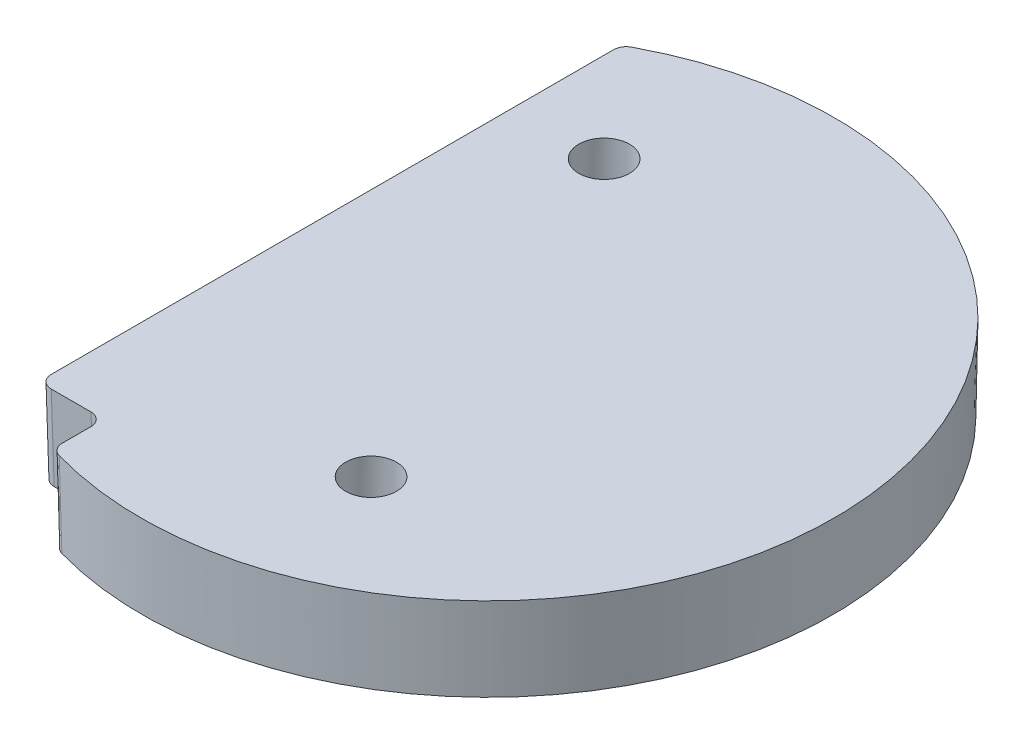
ISO-10303-21;
HEADER;
FILE_DESCRIPTION(('STEP AP214'),'2;1');
FILE_NAME('part.step','',(''),(''),'','','');
FILE_SCHEMA(('AUTOMOTIVE_DESIGN { 1 0 10303 214 1 1 1 1 }'));
ENDSEC;
DATA;
#1=APPLICATION_CONTEXT('core data for automotive mechanical design processes');
#2=APPLICATION_PROTOCOL_DEFINITION('international standard','automotive_design',2000,#1);
#3=PRODUCT_CONTEXT('',#1,'mechanical');
#4=PRODUCT('Part','Part','',(#3));
#5=PRODUCT_RELATED_PRODUCT_CATEGORY('part','',(#4));
#6=PRODUCT_DEFINITION_FORMATION('','',#4);
#7=PRODUCT_DEFINITION_CONTEXT('part definition',#1,'design');
#8=PRODUCT_DEFINITION('design','',#6,#7);
#9=PRODUCT_DEFINITION_SHAPE('','',#8);
#10=(LENGTH_UNIT() NAMED_UNIT(*) SI_UNIT(.MILLI.,.METRE.));
#11=(NAMED_UNIT(*) PLANE_ANGLE_UNIT() SI_UNIT($,.RADIAN.));
#12=(NAMED_UNIT(*) SI_UNIT($,.STERADIAN.) SOLID_ANGLE_UNIT());
#13=UNCERTAINTY_MEASURE_WITH_UNIT(LENGTH_MEASURE(1.E-05),#10,'distance_accuracy_value','');
#14=(GEOMETRIC_REPRESENTATION_CONTEXT(3) GLOBAL_UNCERTAINTY_ASSIGNED_CONTEXT((#13)) GLOBAL_UNIT_ASSIGNED_CONTEXT((#10,
#11,#12)) REPRESENTATION_CONTEXT('',''));
#15=CARTESIAN_POINT('',(0.,0.,0.));
#16=DIRECTION('',(0.,0.,1.));
#17=DIRECTION('',(1.,0.,0.));
#18=AXIS2_PLACEMENT_3D('',#15,#16,#17);
#19=CARTESIAN_POINT('',(0.,24.52774,12.));
#20=DIRECTION('',(0.,1.,0.));
#21=DIRECTION('',(1.,0.,0.));
#22=AXIS2_PLACEMENT_3D('',#19,#20,#21);
#23=CONICAL_SURFACE('',#22,8.2,0.0174532925199433);
#24=CARTESIAN_POINT('',(0.,22.52774,12.));
#25=DIRECTION('',(0.,-1.,0.));
#26=DIRECTION('',(1.,0.,0.));
#27=AXIS2_PLACEMENT_3D('',#24,#25,#26);
#28=CIRCLE('',#27,8.16508987014357);
#29=CARTESIAN_POINT('',(-3.80491359777918,22.52774,4.77564362029696));
#30=VERTEX_POINT('',#29);
#31=CARTESIAN_POINT('',(-2.20618229791224,22.52774,19.8613899697127));
#32=VERTEX_POINT('',#31);
#33=EDGE_CURVE('E107',#30,#32,#28,.T.);
#34=ORIENTED_EDGE('',*,*,#33,.F.);
#35=CARTESIAN_POINT('',(-3.71217040961339,8.03799381055322,5.19539749515387));
#36=CARTESIAN_POINT('',(-3.71213560727633,8.03599998599928,5.01027839007986));
#37=CARTESIAN_POINT('',(-3.54667220525729,8.03799381055322,4.92726666279457));
#38=CARTESIAN_POINT('',(-3.75723812207568,10.6199213283042,5.16758050246682));
#39=CARTESIAN_POINT('',(-3.75715307255751,10.6150488446717,4.9832482453097));
#40=CARTESIAN_POINT('',(-3.5927197204227,10.6199213283043,4.89994101683367));
#41=CARTESIAN_POINT('',(-3.80230586652925,13.2018506788342,5.13993382349185));
#42=CARTESIAN_POINT('',(-3.80222290444024,13.1970977839379,4.95634288757));
#43=CARTESIAN_POINT('',(-3.63874990637708,13.2018506788343,4.87278366437593));
#44=CARTESIAN_POINT('',(-3.89244141586427,18.365712841805,5.08496945897924));
#45=CARTESIAN_POINT('',(-3.89235899243341,18.3609908066135,4.90283774453859));
#46=CARTESIAN_POINT('',(-3.73077731451746,18.3657128418051,4.81879368934304));
#47=CARTESIAN_POINT('',(-3.93750922074572,20.9476456542458,5.05765177343662));
#48=CARTESIAN_POINT('',(-3.93742896675897,20.9430479064245,4.87623509737161));
#49=CARTESIAN_POINT('',(-3.77677453670396,20.9476456542458,4.79196106676297));
#50=CARTESIAN_POINT('',(-4.02764488870242,26.1115146130482,5.00333376098686));
#51=CARTESIAN_POINT('',(-4.02756525635232,26.106952478767,4.82332533585026));
#52=CARTESIAN_POINT('',(-3.86873771331154,26.1115146130482,4.73860869356104));
#53=CARTESIAN_POINT('',(-4.07271275177767,28.6934507594098,4.9763334340794));
#54=CARTESIAN_POINT('',(-4.07263506927037,28.6890003315474,4.79701556073125));
#55=CARTESIAN_POINT('',(-3.91470366773265,28.6934507594099,4.71208894293888));
#56=CARTESIAN_POINT('',(-4.16284853426273,33.8573262795375,4.92263948139414));
#57=CARTESIAN_POINT('',(-4.16277152442006,33.8529143886054,4.74468181268546));
#58=CARTESIAN_POINT('',(-4.00660583899555,33.8573262795376,4.65935149023351));
#59=CARTESIAN_POINT('',(-4.20791645367254,36.4392656533036,4.89594585562098));
#60=CARTESIAN_POINT('',(-4.20784146676971,36.4349696565178,4.71865535864417));
#61=CARTESIAN_POINT('',(-4.05254205583688,36.4392656533037,4.63313378815486));
#62=CARTESIAN_POINT('',(-4.25298439961586,39.0212065471737,4.86940025208404));
#63=CARTESIAN_POINT('',(-4.25295270639966,39.019390844034,4.69274260351006));
#64=CARTESIAN_POINT('',(-4.09846416826321,39.0212065471737,4.60706169905283));
#65=(BOUNDED_SURFACE() B_SPLINE_SURFACE(3,2,((#35,#36,#37),(#38,#39,#40),(#41,#42,#43),(#44,#45,
#46),(#47,#48,#49),(#50,#51,#52),(#53,#54,#55),(#56,#57,#58),(#59,#60,#61),(#62,#63,#64)),
.UNSPECIFIED.,.F.,.F.,.F.) B_SPLINE_SURFACE_WITH_KNOTS((4,2,2,2,4),(3,3),(0.,7.74741190296028,
15.4948236886408,23.2422354667816,30.9896473621978),(0.,1.),
.UNSPECIFIED.) GEOMETRIC_REPRESENTATION_ITEM() RATIONAL_B_SPLINE_SURFACE(((1.,0.851006268897824,
1.),(1.,0.851965571155234,1.),(1.,0.852906266586541,1.),(1.,0.854752433793589,1.),(1.,
0.855657905569863,1.),(1.,0.857435615491543,1.),(1.,0.858307853636982,1.),(1.,0.860020871956144,
1.),(1.,0.86086165212939,1.),(1.,0.861687591132487,1.))) REPRESENTATION_ITEM('') SURFACE());
#66=CARTESIAN_POINT('',(-3.54667220525729,8.03799381055322,4.92726666279457));
#67=CARTESIAN_POINT('',(-3.5927197204227,10.6199213283043,4.89994101683367));
#68=CARTESIAN_POINT('',(-3.63874990637708,13.2018506788343,4.87278366437593));
#69=CARTESIAN_POINT('',(-3.73077731451746,18.3657128418051,4.81879368934304));
#70=CARTESIAN_POINT('',(-3.77677453670396,20.9476456542458,4.79196106676297));
#71=CARTESIAN_POINT('',(-3.86873771331154,26.1115146130482,4.73860869356104));
#72=CARTESIAN_POINT('',(-3.91470366773265,28.6934507594099,4.71208894293888));
#73=CARTESIAN_POINT('',(-4.00660583899555,33.8573262795376,4.65935149023351));
#74=CARTESIAN_POINT('',(-4.05254205583688,36.4392656533037,4.63313378815486));
#75=CARTESIAN_POINT('',(-4.09846416826321,39.0212065471737,4.60706169905283));
#76=B_SPLINE_CURVE_WITH_KNOTS('',3,(#66,#67,#68,#69,#70,#71,#72,#73,#74,#75),.UNSPECIFIED.,.F.,
.F.,(4,2,2,2,4),(0.,7.74741190296028,15.4948236886408,23.2422354667816,30.9896473621978),.UNSPECIFIED.);
#77=CARTESIAN_POINT('',(-3.84053154309473,24.52774,4.75497981600505));
#78=VERTEX_POINT('',#77);
#79=EDGE_CURVE('E92',#30,#78,#76,.T.);
#80=ORIENTED_EDGE('',*,*,#79,.T.);
#81=CARTESIAN_POINT('',(0.,24.52774,12.));
#82=DIRECTION('',(0.,-1.,0.));
#83=DIRECTION('',(1.,0.,0.));
#84=AXIS2_PLACEMENT_3D('',#81,#82,#83);
#85=CIRCLE('',#84,8.2);
#86=CARTESIAN_POINT('',(-2.24205977556281,24.52774,19.8875324381459));
#87=VERTEX_POINT('',#86);
#88=EDGE_CURVE('E105',#78,#87,#85,.T.);
#89=ORIENTED_EDGE('',*,*,#88,.T.);
#90=CARTESIAN_POINT('',(-2.71299484813857,39.0218051426387,19.7877663931651));
#91=CARTESIAN_POINT('',(-2.71294522413037,39.0189621851135,20.0088121721915));
#92=CARTESIAN_POINT('',(-2.50181746925782,39.0218051426387,20.0742820890265));
#93=CARTESIAN_POINT('',(-2.66792814472448,36.4399354332207,19.7545496378408));
#94=CARTESIAN_POINT('',(-2.66781067605068,36.4332056574062,19.9764897886135));
#95=CARTESIAN_POINT('',(-2.45558344016758,36.4399354332208,20.0414270061605));
#96=CARTESIAN_POINT('',(-2.62286148887449,33.8580684487483,19.7211207751597));
#97=CARTESIAN_POINT('',(-2.62274061637163,33.8511436676971,19.9440186339914));
#98=CARTESIAN_POINT('',(-2.40933014801696,33.8580684487484,20.008358027755));
#99=CARTESIAN_POINT('',(-2.53272827911432,28.694340319931,19.6538211507401));
#100=CARTESIAN_POINT('',(-2.53260613928744,28.6873429339351,19.8786783715244));
#101=CARTESIAN_POINT('',(-2.31678295106909,28.694340319931,19.9417736928128));
#102=CARTESIAN_POINT('',(-2.48766172520414,26.1124791755858,19.6199503890156));
#103=CARTESIAN_POINT('',(-2.48753629684602,26.1052933897623,19.845804067714));
#104=CARTESIAN_POINT('',(-2.27048904627313,26.1124791755858,19.9082583362903));
#105=CARTESIAN_POINT('',(-2.39752872316536,20.948762947119,19.5517492799763));
#106=CARTESIAN_POINT('',(-2.39740209932361,20.941508672084,19.7796422580303));
#107=CARTESIAN_POINT('',(-2.17785853446206,20.948762947119,19.8407626558975));
#108=CARTESIAN_POINT('',(-2.35246227503677,18.3669078629973,19.5174189326605));
#109=CARTESIAN_POINT('',(-2.35233196643702,18.3594424883173,19.746349141409));
#110=CARTESIAN_POINT('',(-2.13152192744683,18.3669078629973,19.806782332026));
#111=CARTESIAN_POINT('',(-2.26232948931041,13.2032040270608,19.4482790818377));
#112=CARTESIAN_POINT('',(-2.26219811532571,13.1956776165178,19.6793341819782));
#113=CARTESIAN_POINT('',(-2.03880369547693,13.2032040270608,19.7383360701118));
#114=CARTESIAN_POINT('',(-2.21726315171265,10.6213552752462,19.4134695783155));
#115=CARTESIAN_POINT('',(-2.21712822310047,10.6136252202311,19.6456062605399));
#116=CARTESIAN_POINT('',(-1.99242207052082,10.6213552752462,19.7038701320538));
#117=CARTESIAN_POINT('',(-2.17219687313371,8.03950990461729,19.3784107124404));
#118=CARTESIAN_POINT('',(-2.17214159112368,8.03634280038415,19.6117157532427));
#119=CARTESIAN_POINT('',(-1.94601678015177,8.03950990461728,19.6691510645308));
#120=(BOUNDED_SURFACE() B_SPLINE_SURFACE(3,2,((#90,#91,#92),(#93,#94,#95),(#96,#97,#98),(#99,
#100,#101),(#102,#103,#104),(#105,#106,#107),(#108,#109,#110),(#111,#112,#113),(#114,#115,#116),
(#117,#118,#119)),.UNSPECIFIED.,.F.,.F.,.F.) B_SPLINE_SURFACE_WITH_KNOTS((4,2,2,2,4),(3,3),(0.,
7.7474298929547,15.4948595397666,23.2422892048329,30.9897191160549),(0.,1.),
.UNSPECIFIED.) GEOMETRIC_REPRESENTATION_ITEM() RATIONAL_B_SPLINE_SURFACE(((1.,0.805041183684551,
1.),(1.,0.80383300496031,1.),(1.,0.802602146061991,1.),(1.,0.800092192103472,1.),(1.,
0.798813097044804,1.),(1.,0.796203794872381,1.),(1.,0.794873587758507,1.),(1.,0.79215881363784,
1.),(1.,0.79077424662932,1.),(1.,0.789360875795255,1.))) REPRESENTATION_ITEM('') SURFACE());
#121=CARTESIAN_POINT('',(-2.50181746925782,39.0218051426387,20.0742820890265));
#122=CARTESIAN_POINT('',(-2.45558344016758,36.4399354332208,20.0414270061605));
#123=CARTESIAN_POINT('',(-2.40933014801696,33.8580684487484,20.008358027755));
#124=CARTESIAN_POINT('',(-2.31678295106909,28.694340319931,19.9417736928128));
#125=CARTESIAN_POINT('',(-2.27048904627313,26.1124791755858,19.9082583362903));
#126=CARTESIAN_POINT('',(-2.17785853446206,20.948762947119,19.8407626558975));
#127=CARTESIAN_POINT('',(-2.13152192744683,18.3669078629973,19.806782332026));
#128=CARTESIAN_POINT('',(-2.03880369547693,13.2032040270608,19.7383360701118));
#129=CARTESIAN_POINT('',(-1.99242207052082,10.6213552752462,19.7038701320538));
#130=CARTESIAN_POINT('',(-1.94601678015177,8.03950990461728,19.6691510645308));
#131=B_SPLINE_CURVE_WITH_KNOTS('',3,(#121,#122,#123,#124,#125,#126,#127,#128,#129,#130),
.UNSPECIFIED.,.F.,.F.,(4,2,2,2,4),(0.,7.7474298929547,15.4948595397666,23.2422892048329,
30.9897191160549),.UNSPECIFIED.);
#132=EDGE_CURVE('E109',#87,#32,#131,.T.);
#133=ORIENTED_EDGE('',*,*,#132,.T.);
#134=EDGE_LOOP('',(#34,#80,#89,#133));
#135=FACE_BOUND('',#134,.T.);
#136=ADVANCED_FACE('F16',(#135),#23,.T.);
#137=CARTESIAN_POINT('',(-4.,24.52774,4.84178793273069));
#138=DIRECTION('',(-0.999847695156391,-0.017452406437283,0.));
#139=DIRECTION('',(0.017452406437283,-0.999847695156391,0.));
#140=AXIS2_PLACEMENT_3D('',#137,#138,#139);
#141=PLANE('',#140);
#142=DIRECTION('',(0.,0.,-1.));
#143=VECTOR('',#142,1.);
#144=CARTESIAN_POINT('',(-4.,24.52774,4.84178793273069));
#145=LINE('',#144,#143);
#146=CARTESIAN_POINT('',(-4.,24.52774,18.3182577587224));
#147=VERTEX_POINT('',#146);
#148=CARTESIAN_POINT('',(-4.,24.52774,5.02000115987074));
#149=VERTEX_POINT('',#148);
#150=EDGE_CURVE('E114',#147,#149,#145,.T.);
#151=ORIENTED_EDGE('',*,*,#150,.T.);
#152=CARTESIAN_POINT('',(-4.25298439961586,39.0212065471737,4.86940025208404));
#153=CARTESIAN_POINT('',(-4.20791645367254,36.4392656533037,4.89594585562098));
#154=CARTESIAN_POINT('',(-4.16284853426273,33.8573262795375,4.92263948139414));
#155=CARTESIAN_POINT('',(-4.07271275177767,28.6934507594098,4.9763334340794));
#156=CARTESIAN_POINT('',(-4.02764488870242,26.1115146130482,5.00333376098685));
#157=CARTESIAN_POINT('',(-3.93750922074572,20.9476456542458,5.05765177343662));
#158=CARTESIAN_POINT('',(-3.89244141586427,18.365712841805,5.08496945897924));
#159=CARTESIAN_POINT('',(-3.80230586652925,13.2018506788342,5.13993382349185));
#160=CARTESIAN_POINT('',(-3.75723812207568,10.6199213283042,5.16758050246682));
#161=CARTESIAN_POINT('',(-3.71217040961339,8.03799381055322,5.19539749515387));
#162=B_SPLINE_CURVE_WITH_KNOTS('',3,(#152,#153,#154,#155,#156,#157,#158,#159,#160,#161),
.UNSPECIFIED.,.F.,.F.,(4,2,2,2,4),(0.,7.74741189541622,15.494823673557,23.2422354592375,
30.9896473621978),.UNSPECIFIED.);
#163=CARTESIAN_POINT('',(-3.96508987014356,22.52774,5.04103896278965));
#164=VERTEX_POINT('',#163);
#165=EDGE_CURVE('E93',#149,#164,#162,.T.);
#166=ORIENTED_EDGE('',*,*,#165,.T.);
#167=DIRECTION('',(0.,0.,1.));
#168=VECTOR('',#167,1.);
#169=CARTESIAN_POINT('',(-3.96508987014356,22.52774,4.84178793273069));
#170=LINE('',#169,#168);
#171=CARTESIAN_POINT('',(-3.96508987014356,22.52774,18.283347628866));
#172=VERTEX_POINT('',#171);
#173=EDGE_CURVE('E125',#172,#164,#170,.F.);
#174=ORIENTED_EDGE('',*,*,#173,.F.);
#175=DIRECTION('',(0.0174497491606821,-0.999695459881888,-0.0174497491606828));
#176=VECTOR('',#175,1.);
#177=CARTESIAN_POINT('',(-3.99589649922292,24.2926505979292,18.3141542579453));
#178=LINE('',#177,#176);
#179=EDGE_CURVE('E98',#172,#147,#178,.F.);
#180=ORIENTED_EDGE('',*,*,#179,.T.);
#181=EDGE_LOOP('',(#151,#166,#174,#180));
#182=FACE_BOUND('',#181,.T.);
#183=ADVANCED_FACE('F177',(#182),#141,.T.);
#184=CARTESIAN_POINT('',(0.,22.52774,12.));
#185=DIRECTION('',(0.,-1.,0.));
#186=DIRECTION('',(1.,0.,0.));
#187=AXIS2_PLACEMENT_3D('',#184,#185,#186);
#188=PLANE('',#187);
#189=ORIENTED_EDGE('',*,*,#173,.T.);
#190=CARTESIAN_POINT('',(-3.96508987014356,22.52774,5.04103896278965));
#191=CARTESIAN_POINT('',(-3.96510426560121,22.52774,5.02416152271766));
#192=CARTESIAN_POINT('',(-3.96366644667712,22.52774,5.00728831854005));
#193=CARTESIAN_POINT('',(-3.9579929737233,22.52774,4.97403708851106));
#194=CARTESIAN_POINT('',(-3.95376033171921,22.52774,4.95765854940115));
#195=CARTESIAN_POINT('',(-3.94260127848501,22.52774,4.92583900432154));
#196=CARTESIAN_POINT('',(-3.93567384884718,22.52774,4.91039835535065));
#197=CARTESIAN_POINT('',(-3.91932297236285,22.52774,4.88089380916661));
#198=CARTESIAN_POINT('',(-3.90989870822795,22.52774,4.86683036482183));
#199=CARTESIAN_POINT('',(-3.88881718331129,22.52774,4.84047752329919));
#200=CARTESIAN_POINT('',(-3.87715843584325,22.52774,4.82818931685459));
#201=CARTESIAN_POINT('',(-3.85195677049862,22.52774,4.80576449531546));
#202=CARTESIAN_POINT('',(-3.8384172403917,22.52774,4.79562409259876));
#203=CARTESIAN_POINT('',(-3.81786649503455,22.52774,4.78277327971699));
#204=CARTESIAN_POINT('',(-3.81145251487309,22.52774,4.77908533308788));
#205=CARTESIAN_POINT('',(-3.80491359777918,22.52774,4.77564362029696));
#206=B_SPLINE_CURVE_WITH_KNOTS('',3,(#190,#191,#192,#193,#194,#195,#196,#197,#198,#199,#200,
#201,#202,#203,#204,#205),.UNSPECIFIED.,.F.,.F.,(4,2,2,2,2,2,2,4),(0.,0.0505651183512571,
0.101075830614002,0.151605650338899,0.202152030460161,0.252732158486958,0.303222332508004,
0.325396582777925),.UNSPECIFIED.);
#207=EDGE_CURVE('E222',#164,#30,#206,.T.);
#208=ORIENTED_EDGE('',*,*,#207,.T.);
#209=ORIENTED_EDGE('',*,*,#33,.T.);
#210=CARTESIAN_POINT('',(-2.20618229791224,22.52774,19.8613899697127));
#211=CARTESIAN_POINT('',(-2.22243170359494,22.52774,19.856844733157));
#212=CARTESIAN_POINT('',(-2.23828491464767,22.52774,19.8509032796778));
#213=CARTESIAN_POINT('',(-2.26876784726974,22.52774,19.8364577279302));
#214=CARTESIAN_POINT('',(-2.28339820500204,22.52774,19.8279549728578));
#215=CARTESIAN_POINT('',(-2.31102796752404,22.52774,19.8086073562452));
#216=CARTESIAN_POINT('',(-2.32402669223311,22.52774,19.7977615231786));
#217=CARTESIAN_POINT('',(-2.34801524120239,22.52774,19.7740451621404));
#218=CARTESIAN_POINT('',(-2.35900565796823,22.52774,19.7611752334241));
#219=CARTESIAN_POINT('',(-2.37866957295573,22.52774,19.7337733899887));
#220=CARTESIAN_POINT('',(-2.38734306338544,22.52774,19.7192414696806));
#221=CARTESIAN_POINT('',(-2.4021288637527,22.52774,19.6889238269495));
#222=CARTESIAN_POINT('',(-2.40824093964884,22.52774,19.6731379901104));
#223=CARTESIAN_POINT('',(-2.41699349135236,22.52774,19.6432709628876));
#224=CARTESIAN_POINT('',(-2.42002411731439,22.52774,19.6293025856081));
#225=CARTESIAN_POINT('',(-2.42407467423802,22.52774,19.6010884666192));
#226=CARTESIAN_POINT('',(-2.42509614681366,22.52774,19.5868429460436));
#227=CARTESIAN_POINT('',(-2.42508987014356,22.52774,19.5725924389954));
#228=B_SPLINE_CURVE_WITH_KNOTS('',3,(#210,#211,#212,#213,#214,#215,#216,#217,#218,#219,#220,
#221,#222,#223,#224,#225,#226,#227),.UNSPECIFIED.,.F.,.F.,(4,2,2,2,2,2,2,2,4),(0.,
0.0505522723681562,0.101078080167789,0.151624878177368,0.202156739340725,0.252688770443567,
0.303225417749909,0.345964210688234,0.388670197536908),.UNSPECIFIED.);
#229=CARTESIAN_POINT('',(-2.42508987014356,22.52774,19.5725924389954));
#230=VERTEX_POINT('',#229);
#231=EDGE_CURVE('E45',#32,#230,#228,.T.);
#232=ORIENTED_EDGE('',*,*,#231,.T.);
#233=DIRECTION('',(0.,0.,1.));
#234=VECTOR('',#233,1.);
#235=CARTESIAN_POINT('',(-2.42508987014356,22.52774,12.));
#236=LINE('',#235,#234);
#237=CARTESIAN_POINT('',(-2.42508987014356,22.52774,18.8832562459598));
#238=VERTEX_POINT('',#237);
#239=EDGE_CURVE('E128',#230,#238,#236,.F.);
#240=ORIENTED_EDGE('',*,*,#239,.T.);
#241=CARTESIAN_POINT('',(-2.72513556855674,22.52774,18.883347635826));
#242=DIRECTION('',(0.,-1.,0.));
#243=DIRECTION('',(0.707106781186548,0.,-0.707106781186547));
#244=AXIS2_PLACEMENT_3D('',#241,#242,#243);
#245=ELLIPSE('',#244,0.300091389867315,0.3);
#246=CARTESIAN_POINT('',(-2.72504417869048,22.52774,18.5833019374129));
#247=VERTEX_POINT('',#246);
#248=EDGE_CURVE('E11',#238,#247,#245,.F.);
#249=ORIENTED_EDGE('',*,*,#248,.T.);
#250=DIRECTION('',(1.,0.,0.));
#251=VECTOR('',#250,1.);
#252=CARTESIAN_POINT('',(-6.04166282336501,22.52774,18.5833019374129));
#253=LINE('',#252,#251);
#254=CARTESIAN_POINT('',(-3.66513556159664,22.52774,18.5833019374129));
#255=VERTEX_POINT('',#254);
#256=EDGE_CURVE('E130',#247,#255,#253,.F.);
#257=ORIENTED_EDGE('',*,*,#256,.T.);
#258=CARTESIAN_POINT('',(-3.66504417173039,22.52774,18.2832562389997));
#259=DIRECTION('',(0.,-1.,0.));
#260=DIRECTION('',(-0.707106781186548,0.,0.707106781186547));
#261=AXIS2_PLACEMENT_3D('',#258,#259,#260);
#262=ELLIPSE('',#261,0.300091389867315,0.3);
#263=EDGE_CURVE('E259',#255,#172,#262,.T.);
#264=ORIENTED_EDGE('',*,*,#263,.T.);
#265=EDGE_LOOP('',(#189,#208,#209,#232,#240,#249,#257,#264));
#266=FACE_BOUND('',#265,.T.);
#267=CARTESIAN_POINT('',(1.87796455876052,22.52774,16.6338394056065));
#268=DIRECTION('',(0.,-1.,0.));
#269=DIRECTION('',(1.,0.,0.));
#270=AXIS2_PLACEMENT_3D('',#267,#268,#269);
#271=CIRCLE('',#270,0.634910129856435);
#272=CARTESIAN_POINT('',(2.51287468861695,22.52774,16.6338394056065));
#273=VERTEX_POINT('',#272);
#274=EDGE_CURVE('E137',#273,#273,#271,.F.);
#275=ORIENTED_EDGE('',*,*,#274,.T.);
#276=EDGE_LOOP('',(#275));
#277=FACE_BOUND('',#276,.T.);
#278=CARTESIAN_POINT('',(-1.8783962897372,22.52774,7.36616692672199));
#279=DIRECTION('',(0.,-1.,0.));
#280=DIRECTION('',(1.,0.,0.));
#281=AXIS2_PLACEMENT_3D('',#278,#279,#280);
#282=CIRCLE('',#281,0.634910129856435);
#283=CARTESIAN_POINT('',(-1.24348615988077,22.52774,7.36616692672199));
#284=VERTEX_POINT('',#283);
#285=EDGE_CURVE('E115',#284,#284,#282,.F.);
#286=ORIENTED_EDGE('',*,*,#285,.T.);
#287=EDGE_LOOP('',(#286));
#288=FACE_BOUND('',#287,.T.);
#289=ADVANCED_FACE('F215',(#266,#277,#288),#188,.T.);
#290=CARTESIAN_POINT('',(0.,24.52774,12.));
#291=DIRECTION('',(0.,-1.,0.));
#292=DIRECTION('',(1.,0.,0.));
#293=AXIS2_PLACEMENT_3D('',#290,#291,#292);
#294=PLANE('',#293);
#295=CARTESIAN_POINT('',(1.87796455876052,24.52774,16.6338394056065));
#296=DIRECTION('',(0.,1.,0.));
#297=DIRECTION('',(-1.,0.,0.));
#298=AXIS2_PLACEMENT_3D('',#295,#296,#297);
#299=CIRCLE('',#298,0.6);
#300=CARTESIAN_POINT('',(1.27796455876052,24.52774,16.6338394056065));
#301=VERTEX_POINT('',#300);
#302=EDGE_CURVE('E134',#301,#301,#299,.T.);
#303=ORIENTED_EDGE('',*,*,#302,.F.);
#304=EDGE_LOOP('',(#303));
#305=FACE_BOUND('',#304,.T.);
#306=CARTESIAN_POINT('',(-1.8783962897372,24.52774,7.36616692672199));
#307=DIRECTION('',(0.,1.,0.));
#308=DIRECTION('',(-1.,0.,0.));
#309=AXIS2_PLACEMENT_3D('',#306,#307,#308);
#310=CIRCLE('',#309,0.6);
#311=CARTESIAN_POINT('',(-2.4783962897372,24.52774,7.36616692672199));
#312=VERTEX_POINT('',#311);
#313=EDGE_CURVE('E119',#312,#312,#310,.T.);
#314=ORIENTED_EDGE('',*,*,#313,.F.);
#315=EDGE_LOOP('',(#314));
#316=FACE_BOUND('',#315,.T.);
#317=ORIENTED_EDGE('',*,*,#88,.F.);
#318=CARTESIAN_POINT('',(-3.84053154309473,24.52774,4.75497981600505));
#319=CARTESIAN_POINT('',(-3.85545023316083,24.52774,4.76287180787066));
#320=CARTESIAN_POINT('',(-3.86968501819868,24.52774,4.77204491961782));
#321=CARTESIAN_POINT('',(-3.89640654182183,24.52774,4.79263113912422));
#322=CARTESIAN_POINT('',(-3.90889516152137,24.52774,4.8040418040552));
#323=CARTESIAN_POINT('',(-3.93178241881937,24.52774,4.82880405029882));
#324=CARTESIAN_POINT('',(-3.94218026539305,24.52774,4.8421563629361));
#325=CARTESIAN_POINT('',(-3.96059065413087,24.52774,4.87042166499471));
#326=CARTESIAN_POINT('',(-3.96860238703259,24.52774,4.88533518159384));
#327=CARTESIAN_POINT('',(-3.98201260009802,24.52774,4.91630438103051));
#328=CARTESIAN_POINT('',(-3.98740930172465,24.52774,4.93236083271332));
#329=CARTESIAN_POINT('',(-3.99541907892543,24.52774,4.96513051681529));
#330=CARTESIAN_POINT('',(-3.99803717942788,24.52774,4.98184250676074));
#331=CARTESIAN_POINT('',(-3.999747109233,24.52774,5.00575177794395));
#332=CARTESIAN_POINT('',(-4.00000178270006,24.52774,5.01287847441611));
#333=CARTESIAN_POINT('',(-4.,24.52774,5.02000115987074));
#334=B_SPLINE_CURVE_WITH_KNOTS('',3,(#318,#319,#320,#321,#322,#323,#324,#325,#326,#327,#328,
#329,#330,#331,#332,#333),.UNSPECIFIED.,.F.,.F.,(4,2,2,2,2,2,2,4),(0.,0.0505653559264371,
0.101075811886197,0.151605342203339,0.20215199040001,0.252732968337529,0.303222317019085,
0.324596551491449),.UNSPECIFIED.);
#335=EDGE_CURVE('E88',#78,#149,#334,.T.);
#336=ORIENTED_EDGE('',*,*,#335,.T.);
#337=ORIENTED_EDGE('',*,*,#150,.F.);
#338=CARTESIAN_POINT('',(-3.69995430158683,24.52774,18.3181663688561));
#339=DIRECTION('',(0.,-1.,0.));
#340=DIRECTION('',(-0.707106781186548,0.,0.707106781186547));
#341=AXIS2_PLACEMENT_3D('',#338,#339,#340);
#342=ELLIPSE('',#341,0.300091389867315,0.3);
#343=CARTESIAN_POINT('',(-3.70004569145308,24.52774,18.6182120672693));
#344=VERTEX_POINT('',#343);
#345=EDGE_CURVE('E108',#147,#344,#342,.F.);
#346=ORIENTED_EDGE('',*,*,#345,.T.);
#347=DIRECTION('',(-1.,0.,0.));
#348=VECTOR('',#347,1.);
#349=CARTESIAN_POINT('',(-6.04166282336501,24.52774,18.6182120672693));
#350=LINE('',#349,#348);
#351=CARTESIAN_POINT('',(-2.75995430854691,24.52774,18.6182120672693));
#352=VERTEX_POINT('',#351);
#353=EDGE_CURVE('E131',#352,#344,#350,.T.);
#354=ORIENTED_EDGE('',*,*,#353,.F.);
#355=CARTESIAN_POINT('',(-2.76004569841316,24.52774,18.9182577656825));
#356=DIRECTION('',(0.,-1.,0.));
#357=DIRECTION('',(0.707106781186548,0.,-0.707106781186547));
#358=AXIS2_PLACEMENT_3D('',#355,#356,#357);
#359=ELLIPSE('',#358,0.300091389867315,0.3);
#360=CARTESIAN_POINT('',(-2.46,24.52774,18.9181663758162));
#361=VERTEX_POINT('',#360);
#362=EDGE_CURVE('E30',#352,#361,#359,.T.);
#363=ORIENTED_EDGE('',*,*,#362,.T.);
#364=DIRECTION('',(0.,0.,1.));
#365=VECTOR('',#364,1.);
#366=CARTESIAN_POINT('',(-2.46,24.52774,12.));
#367=LINE('',#366,#365);
#368=CARTESIAN_POINT('',(-2.46,24.52774,19.5990081285574));
#369=VERTEX_POINT('',#368);
#370=EDGE_CURVE('E124',#361,#369,#367,.T.);
#371=ORIENTED_EDGE('',*,*,#370,.T.);
#372=CARTESIAN_POINT('',(-2.46,24.52774,19.5990081285574));
#373=CARTESIAN_POINT('',(-2.46001435794084,24.52774,19.6158812915637));
#374=CARTESIAN_POINT('',(-2.45857737537465,24.52774,19.6327502512718));
#375=CARTESIAN_POINT('',(-2.45290550406159,24.52774,19.6660024987123));
#376=CARTESIAN_POINT('',(-2.44867209803736,24.52774,19.6823860390169));
#377=CARTESIAN_POINT('',(-2.43750963449609,24.52774,19.7142156566462));
#378=CARTESIAN_POINT('',(-2.43057945897547,24.52774,19.7296613420889));
#379=CARTESIAN_POINT('',(-2.41422687746486,24.52774,19.7591657231749));
#380=CARTESIAN_POINT('',(-2.40480519090622,24.52774,19.7732248175942));
#381=CARTESIAN_POINT('',(-2.38373557193549,24.52774,19.7995614073518));
#382=CARTESIAN_POINT('',(-2.37208761472422,24.52774,19.8118388828413));
#383=CARTESIAN_POINT('',(-2.34689257720104,24.52774,19.8342664560106));
#384=CARTESIAN_POINT('',(-2.3333453636902,24.52774,19.8444164043576));
#385=CARTESIAN_POINT('',(-2.30709615566914,24.52774,19.8608247399256));
#386=CARTESIAN_POINT('',(-2.29462059375869,24.52774,19.8674484564136));
#387=CARTESIAN_POINT('',(-2.26887588002596,24.52774,19.8788791429967));
#388=CARTESIAN_POINT('',(-2.25560739575684,24.52774,19.8836876170472));
#389=CARTESIAN_POINT('',(-2.24205977556281,24.52774,19.8875324381459));
#390=B_SPLINE_CURVE_WITH_KNOTS('',3,(#372,#373,#374,#375,#376,#377,#378,#379,#380,#381,#382,
#383,#384,#385,#386,#387,#388,#389),.UNSPECIFIED.,.F.,.F.,(4,2,2,2,2,2,2,2,4),(0.,
0.0505524063567851,0.101078030254569,0.151624622986546,0.202156636143998,0.252689212227421,
0.303225334043615,0.34546395103447,0.387667495494842),.UNSPECIFIED.);
#391=EDGE_CURVE('E99',#369,#87,#390,.T.);
#392=ORIENTED_EDGE('',*,*,#391,.T.);
#393=EDGE_LOOP('',(#317,#336,#337,#346,#354,#363,#371,#392));
#394=FACE_BOUND('',#393,.T.);
#395=ADVANCED_FACE('F111',(#305,#316,#394),#294,.F.);
#396=CARTESIAN_POINT('',(-1.8783962897372,24.52774,7.36616692672199));
#397=DIRECTION('',(0.,-1.,0.));
#398=DIRECTION('',(-1.,0.,0.));
#399=AXIS2_PLACEMENT_3D('',#396,#397,#398);
#400=CONICAL_SURFACE('',#399,0.6,0.0174532925199433);
#401=ORIENTED_EDGE('',*,*,#285,.F.);
#402=EDGE_LOOP('',(#401));
#403=FACE_BOUND('',#402,.T.);
#404=ORIENTED_EDGE('',*,*,#313,.T.);
#405=EDGE_LOOP('',(#404));
#406=FACE_BOUND('',#405,.T.);
#407=ADVANCED_FACE('F240',(#403,#406),#400,.F.);
#408=CARTESIAN_POINT('',(1.87796455876052,24.52774,16.6338394056065));
#409=DIRECTION('',(0.,-1.,0.));
#410=DIRECTION('',(-1.,0.,0.));
#411=AXIS2_PLACEMENT_3D('',#408,#409,#410);
#412=CONICAL_SURFACE('',#411,0.6,0.0174532925199433);
#413=ORIENTED_EDGE('',*,*,#274,.F.);
#414=EDGE_LOOP('',(#413));
#415=FACE_BOUND('',#414,.T.);
#416=ORIENTED_EDGE('',*,*,#302,.T.);
#417=EDGE_LOOP('',(#416));
#418=FACE_BOUND('',#417,.T.);
#419=ADVANCED_FACE('F296',(#415,#418),#412,.F.);
#420=CARTESIAN_POINT('',(-6.04166282336501,24.52774,18.6182120672693));
#421=DIRECTION('',(0.,-0.0174524064372837,0.999847695156391));
#422=DIRECTION('',(0.,-0.999847695156391,-0.0174524064372837));
#423=AXIS2_PLACEMENT_3D('',#420,#421,#422);
#424=PLANE('',#423);
#425=ORIENTED_EDGE('',*,*,#256,.F.);
#426=DIRECTION('',(0.0174497491606821,-0.999695459881888,-0.0174497491606828));
#427=VECTOR('',#426,1.);
#428=CARTESIAN_POINT('',(-2.75986297433594,24.5225074665581,18.6181207330583));
#429=LINE('',#428,#427);
#430=EDGE_CURVE('E190',#247,#352,#429,.F.);
#431=ORIENTED_EDGE('',*,*,#430,.T.);
#432=ORIENTED_EDGE('',*,*,#353,.T.);
#433=DIRECTION('',(0.0174497491606821,-0.999695459881888,-0.0174497491606828));
#434=VECTOR('',#433,1.);
#435=CARTESIAN_POINT('',(-3.70075869922473,24.5685881878808,18.618925075041));
#436=LINE('',#435,#434);
#437=EDGE_CURVE('E220',#344,#255,#436,.T.);
#438=ORIENTED_EDGE('',*,*,#437,.T.);
#439=EDGE_LOOP('',(#425,#431,#432,#438));
#440=FACE_BOUND('',#439,.T.);
#441=ADVANCED_FACE('F158',(#440),#424,.T.);
#442=CARTESIAN_POINT('',(-2.46,24.52774,12.));
#443=DIRECTION('',(-0.999847695156391,-0.017452406437283,0.));
#444=DIRECTION('',(0.017452406437283,-0.999847695156391,0.));
#445=AXIS2_PLACEMENT_3D('',#442,#443,#444);
#446=PLANE('',#445);
#447=ORIENTED_EDGE('',*,*,#370,.F.);
#448=DIRECTION('',(0.0174497491606821,-0.999695459881888,-0.0174497491606828));
#449=VECTOR('',#448,1.);
#450=CARTESIAN_POINT('',(-2.42499853593259,22.5225074665581,18.8831649117488));
#451=LINE('',#450,#449);
#452=EDGE_CURVE('E38',#361,#238,#451,.T.);
#453=ORIENTED_EDGE('',*,*,#452,.T.);
#454=ORIENTED_EDGE('',*,*,#239,.F.);
#455=CARTESIAN_POINT('',(-2.17219687313371,8.03950990461729,19.3784107124404));
#456=CARTESIAN_POINT('',(-2.21726315171265,10.6213552752462,19.4134695783155));
#457=CARTESIAN_POINT('',(-2.26232948931041,13.2032040270608,19.4482790818377));
#458=CARTESIAN_POINT('',(-2.35246227503677,18.3669078629973,19.5174189326605));
#459=CARTESIAN_POINT('',(-2.39752872316536,20.948762947119,19.5517492799763));
#460=CARTESIAN_POINT('',(-2.48766172520414,26.1124791755858,19.6199503890156));
#461=CARTESIAN_POINT('',(-2.53272827911432,28.694340319931,19.6538211507401));
#462=CARTESIAN_POINT('',(-2.62286148887449,33.8580684487483,19.7211207751597));
#463=CARTESIAN_POINT('',(-2.66792814472448,36.4399354332207,19.7545496378408));
#464=CARTESIAN_POINT('',(-2.71299484813857,39.0218051426387,19.7877663931651));
#465=B_SPLINE_CURVE_WITH_KNOTS('',3,(#455,#456,#457,#458,#459,#460,#461,#462,#463,#464),
.UNSPECIFIED.,.F.,.F.,(4,2,2,2,4),(0.,7.74742991122197,15.4948595762883,23.2422892231002,
30.9897191160549),.UNSPECIFIED.);
#466=EDGE_CURVE('E182',#230,#369,#465,.T.);
#467=ORIENTED_EDGE('',*,*,#466,.T.);
#468=EDGE_LOOP('',(#447,#453,#454,#467));
#469=FACE_BOUND('',#468,.T.);
#470=ADVANCED_FACE('F173',(#469),#446,.T.);
#471=ORIENTED_EDGE('',*,*,#207,.F.);
#472=ORIENTED_EDGE('',*,*,#165,.F.);
#473=ORIENTED_EDGE('',*,*,#335,.F.);
#474=ORIENTED_EDGE('',*,*,#79,.F.);
#475=EDGE_LOOP('',(#471,#472,#473,#474));
#476=FACE_BOUND('',#475,.T.);
#477=ADVANCED_FACE('F91',(#476),#65,.T.);
#478=CARTESIAN_POINT('',(-2.76095356826512,24.5797518289841,18.9191656355345));
#479=DIRECTION('',(0.0174497491606821,-0.999695459881887,-0.0174497491606828));
#480=DIRECTION('',(0.,0.0174524064372837,-0.999847695156391));
#481=AXIS2_PLACEMENT_3D('',#478,#479,#480);
#482=CYLINDRICAL_SURFACE('',#481,0.3);
#483=ORIENTED_EDGE('',*,*,#248,.F.);
#484=ORIENTED_EDGE('',*,*,#452,.F.);
#485=ORIENTED_EDGE('',*,*,#362,.F.);
#486=ORIENTED_EDGE('',*,*,#430,.F.);
#487=EDGE_LOOP('',(#483,#484,#485,#486));
#488=FACE_BOUND('',#487,.T.);
#489=ADVANCED_FACE('F167',(#488),#482,.F.);
#490=ORIENTED_EDGE('',*,*,#391,.F.);
#491=ORIENTED_EDGE('',*,*,#466,.F.);
#492=ORIENTED_EDGE('',*,*,#231,.F.);
#493=ORIENTED_EDGE('',*,*,#132,.F.);
#494=EDGE_LOOP('',(#490,#491,#492,#493));
#495=FACE_BOUND('',#494,.T.);
#496=ADVANCED_FACE('F163',(#495),#120,.T.);
#497=CARTESIAN_POINT('',(-3.69594219067599,24.2978863198605,18.3141542579453));
#498=DIRECTION('',(-0.0174497491606821,0.999695459881887,0.0174497491606828));
#499=DIRECTION('',(0.,-0.0174524064372837,0.999847695156391));
#500=AXIS2_PLACEMENT_3D('',#497,#498,#499);
#501=CYLINDRICAL_SURFACE('',#500,0.3);
#502=ORIENTED_EDGE('',*,*,#263,.F.);
#503=ORIENTED_EDGE('',*,*,#437,.F.);
#504=ORIENTED_EDGE('',*,*,#345,.F.);
#505=ORIENTED_EDGE('',*,*,#179,.F.);
#506=EDGE_LOOP('',(#502,#503,#504,#505));
#507=FACE_BOUND('',#506,.T.);
#508=ADVANCED_FACE('F18',(#507),#501,.T.);
#509=CLOSED_SHELL('',(#136,#183,#289,#395,#407,#419,#441,#470,#477,#489,#496,#508));
#510=MANIFOLD_SOLID_BREP('B1',#509);
#511=ADVANCED_BREP_SHAPE_REPRESENTATION('',(#18,#510),#14);
#512=SHAPE_DEFINITION_REPRESENTATION(#9,#511);
ENDSEC;
END-ISO-10303-21;
